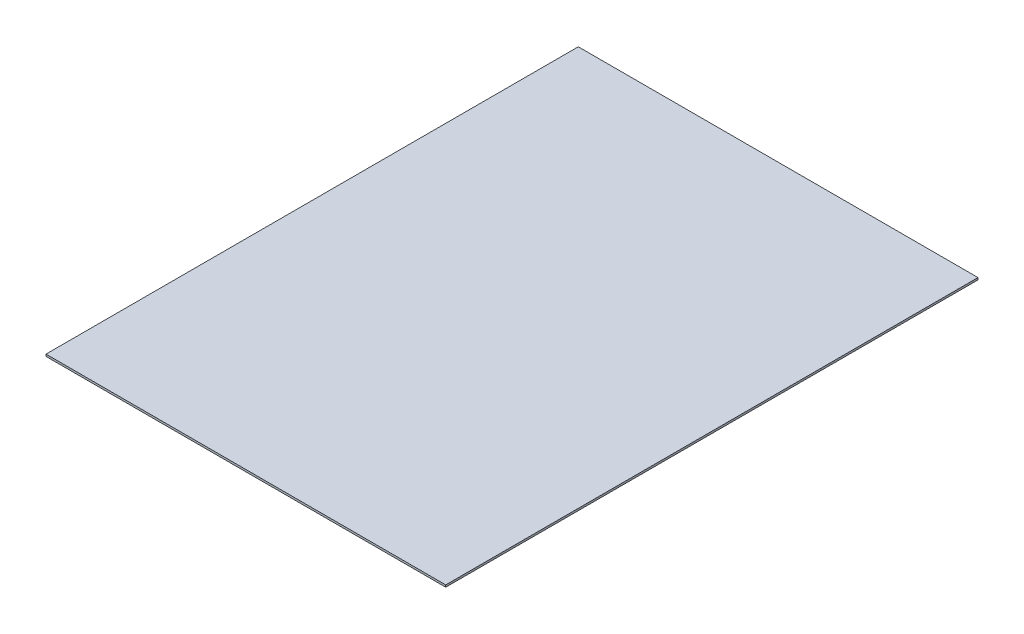
ISO-10303-21;
HEADER;
FILE_DESCRIPTION(('STEP AP214'),'2;1');
FILE_NAME('part.step','',(''),(''),'','','');
FILE_SCHEMA(('AUTOMOTIVE_DESIGN { 1 0 10303 214 1 1 1 1 }'));
ENDSEC;
DATA;
#1=APPLICATION_CONTEXT('core data for automotive mechanical design processes');
#2=APPLICATION_PROTOCOL_DEFINITION('international standard','automotive_design',2000,#1);
#3=PRODUCT_CONTEXT('',#1,'mechanical');
#4=PRODUCT('Part','Part','',(#3));
#5=PRODUCT_RELATED_PRODUCT_CATEGORY('part','',(#4));
#6=PRODUCT_DEFINITION_FORMATION('','',#4);
#7=PRODUCT_DEFINITION_CONTEXT('part definition',#1,'design');
#8=PRODUCT_DEFINITION('design','',#6,#7);
#9=PRODUCT_DEFINITION_SHAPE('','',#8);
#10=(LENGTH_UNIT() NAMED_UNIT(*) SI_UNIT(.MILLI.,.METRE.));
#11=(NAMED_UNIT(*) PLANE_ANGLE_UNIT() SI_UNIT($,.RADIAN.));
#12=(NAMED_UNIT(*) SI_UNIT($,.STERADIAN.) SOLID_ANGLE_UNIT());
#13=UNCERTAINTY_MEASURE_WITH_UNIT(LENGTH_MEASURE(1.E-05),#10,'distance_accuracy_value','');
#14=(GEOMETRIC_REPRESENTATION_CONTEXT(3) GLOBAL_UNCERTAINTY_ASSIGNED_CONTEXT((#13)) GLOBAL_UNIT_ASSIGNED_CONTEXT((#10,
#11,#12)) REPRESENTATION_CONTEXT('',''));
#15=CARTESIAN_POINT('',(0.,0.,0.));
#16=DIRECTION('',(0.,0.,1.));
#17=DIRECTION('',(1.,0.,0.));
#18=AXIS2_PLACEMENT_3D('',#15,#16,#17);
#19=CARTESIAN_POINT('',(0.,3.175,0.));
#20=DIRECTION('',(1.,0.,0.));
#21=DIRECTION('',(0.,0.,-1.));
#22=AXIS2_PLACEMENT_3D('',#19,#20,#21);
#23=PLANE('',#22);
#24=DIRECTION('',(0.,0.,1.));
#25=VECTOR('',#24,1.);
#26=CARTESIAN_POINT('',(0.,0.,0.));
#27=LINE('',#26,#25);
#28=CARTESIAN_POINT('',(0.,0.,-828.675));
#29=VERTEX_POINT('',#28);
#30=CARTESIAN_POINT('',(0.,0.,0.));
#31=VERTEX_POINT('',#30);
#32=EDGE_CURVE('E95',#29,#31,#27,.T.);
#33=ORIENTED_EDGE('',*,*,#32,.T.);
#34=DIRECTION('',(0.,-1.,0.));
#35=VECTOR('',#34,1.);
#36=CARTESIAN_POINT('',(0.,3.175,0.));
#37=LINE('',#36,#35);
#38=CARTESIAN_POINT('',(0.,3.175,0.));
#39=VERTEX_POINT('',#38);
#40=EDGE_CURVE('E11',#39,#31,#37,.T.);
#41=ORIENTED_EDGE('',*,*,#40,.F.);
#42=DIRECTION('',(0.,0.,1.));
#43=VECTOR('',#42,1.);
#44=CARTESIAN_POINT('',(0.,3.175,0.));
#45=LINE('',#44,#43);
#46=CARTESIAN_POINT('',(0.,3.175,-828.675));
#47=VERTEX_POINT('',#46);
#48=EDGE_CURVE('E83',#47,#39,#45,.T.);
#49=ORIENTED_EDGE('',*,*,#48,.F.);
#50=DIRECTION('',(0.,-1.,0.));
#51=VECTOR('',#50,1.);
#52=CARTESIAN_POINT('',(0.,3.175,-828.675));
#53=LINE('',#52,#51);
#54=EDGE_CURVE('E91',#47,#29,#53,.T.);
#55=ORIENTED_EDGE('',*,*,#54,.T.);
#56=EDGE_LOOP('',(#33,#41,#49,#55));
#57=FACE_BOUND('',#56,.T.);
#58=ADVANCED_FACE('F32',(#57),#23,.F.);
#59=CARTESIAN_POINT('',(0.,3.175,0.));
#60=DIRECTION('',(0.,0.,-1.));
#61=DIRECTION('',(-1.,0.,0.));
#62=AXIS2_PLACEMENT_3D('',#59,#60,#61);
#63=PLANE('',#62);
#64=DIRECTION('',(1.,0.,0.));
#65=VECTOR('',#64,1.);
#66=CARTESIAN_POINT('',(0.,0.,0.));
#67=LINE('',#66,#65);
#68=CARTESIAN_POINT('',(622.3,0.,0.));
#69=VERTEX_POINT('',#68);
#70=EDGE_CURVE('E87',#31,#69,#67,.T.);
#71=ORIENTED_EDGE('',*,*,#70,.T.);
#72=DIRECTION('',(0.,-1.,0.));
#73=VECTOR('',#72,1.);
#74=CARTESIAN_POINT('',(622.3,3.175,0.));
#75=LINE('',#74,#73);
#76=CARTESIAN_POINT('',(622.3,3.175,0.));
#77=VERTEX_POINT('',#76);
#78=EDGE_CURVE('E40',#77,#69,#75,.T.);
#79=ORIENTED_EDGE('',*,*,#78,.F.);
#80=DIRECTION('',(1.,0.,0.));
#81=VECTOR('',#80,1.);
#82=CARTESIAN_POINT('',(0.,3.175,0.));
#83=LINE('',#82,#81);
#84=EDGE_CURVE('E78',#39,#77,#83,.T.);
#85=ORIENTED_EDGE('',*,*,#84,.F.);
#86=ORIENTED_EDGE('',*,*,#40,.T.);
#87=EDGE_LOOP('',(#71,#79,#85,#86));
#88=FACE_BOUND('',#87,.T.);
#89=ADVANCED_FACE('F86',(#88),#63,.F.);
#90=CARTESIAN_POINT('',(622.3,3.175,0.));
#91=DIRECTION('',(-1.,0.,0.));
#92=DIRECTION('',(0.,0.,1.));
#93=AXIS2_PLACEMENT_3D('',#90,#91,#92);
#94=PLANE('',#93);
#95=DIRECTION('',(0.,0.,-1.));
#96=VECTOR('',#95,1.);
#97=CARTESIAN_POINT('',(622.3,0.,0.));
#98=LINE('',#97,#96);
#99=CARTESIAN_POINT('',(622.3,0.,-828.675));
#100=VERTEX_POINT('',#99);
#101=EDGE_CURVE('E65',#69,#100,#98,.T.);
#102=ORIENTED_EDGE('',*,*,#101,.T.);
#103=DIRECTION('',(0.,-1.,0.));
#104=VECTOR('',#103,1.);
#105=CARTESIAN_POINT('',(622.3,3.175,-828.675));
#106=LINE('',#105,#104);
#107=CARTESIAN_POINT('',(622.3,3.175,-828.675));
#108=VERTEX_POINT('',#107);
#109=EDGE_CURVE('E88',#108,#100,#106,.T.);
#110=ORIENTED_EDGE('',*,*,#109,.F.);
#111=DIRECTION('',(0.,0.,-1.));
#112=VECTOR('',#111,1.);
#113=CARTESIAN_POINT('',(622.3,3.175,0.));
#114=LINE('',#113,#112);
#115=EDGE_CURVE('E81',#77,#108,#114,.T.);
#116=ORIENTED_EDGE('',*,*,#115,.F.);
#117=ORIENTED_EDGE('',*,*,#78,.T.);
#118=EDGE_LOOP('',(#102,#110,#116,#117));
#119=FACE_BOUND('',#118,.T.);
#120=ADVANCED_FACE('F89',(#119),#94,.F.);
#121=CARTESIAN_POINT('',(0.,3.175,-828.675));
#122=DIRECTION('',(0.,0.,1.));
#123=DIRECTION('',(1.,0.,0.));
#124=AXIS2_PLACEMENT_3D('',#121,#122,#123);
#125=PLANE('',#124);
#126=DIRECTION('',(-1.,0.,0.));
#127=VECTOR('',#126,1.);
#128=CARTESIAN_POINT('',(0.,0.,-828.675));
#129=LINE('',#128,#127);
#130=EDGE_CURVE('E71',#100,#29,#129,.T.);
#131=ORIENTED_EDGE('',*,*,#130,.T.);
#132=ORIENTED_EDGE('',*,*,#54,.F.);
#133=DIRECTION('',(-1.,0.,0.));
#134=VECTOR('',#133,1.);
#135=CARTESIAN_POINT('',(0.,3.175,-828.675));
#136=LINE('',#135,#134);
#137=EDGE_CURVE('E48',#108,#47,#136,.T.);
#138=ORIENTED_EDGE('',*,*,#137,.F.);
#139=ORIENTED_EDGE('',*,*,#109,.T.);
#140=EDGE_LOOP('',(#131,#132,#138,#139));
#141=FACE_BOUND('',#140,.T.);
#142=ADVANCED_FACE('F102',(#141),#125,.F.);
#143=CARTESIAN_POINT('',(0.,3.175,0.));
#144=DIRECTION('',(0.,-1.,0.));
#145=DIRECTION('',(0.,0.,-1.));
#146=AXIS2_PLACEMENT_3D('',#143,#144,#145);
#147=PLANE('',#146);
#148=ORIENTED_EDGE('',*,*,#48,.T.);
#149=ORIENTED_EDGE('',*,*,#84,.T.);
#150=ORIENTED_EDGE('',*,*,#115,.T.);
#151=ORIENTED_EDGE('',*,*,#137,.T.);
#152=EDGE_LOOP('',(#148,#149,#150,#151));
#153=FACE_BOUND('',#152,.T.);
#154=ADVANCED_FACE('F79',(#153),#147,.F.);
#155=CARTESIAN_POINT('',(0.,0.,0.));
#156=DIRECTION('',(0.,-1.,0.));
#157=DIRECTION('',(0.,0.,-1.));
#158=AXIS2_PLACEMENT_3D('',#155,#156,#157);
#159=PLANE('',#158);
#160=ORIENTED_EDGE('',*,*,#32,.F.);
#161=ORIENTED_EDGE('',*,*,#130,.F.);
#162=ORIENTED_EDGE('',*,*,#101,.F.);
#163=ORIENTED_EDGE('',*,*,#70,.F.);
#164=EDGE_LOOP('',(#160,#161,#162,#163));
#165=FACE_BOUND('',#164,.T.);
#166=ADVANCED_FACE('F105',(#165),#159,.T.);
#167=CLOSED_SHELL('',(#58,#89,#120,#142,#154,#166));
#168=MANIFOLD_SOLID_BREP('B2',#167);
#169=ADVANCED_BREP_SHAPE_REPRESENTATION('',(#18,#168),#14);
#170=SHAPE_DEFINITION_REPRESENTATION(#9,#169);
ENDSEC;
END-ISO-10303-21;
